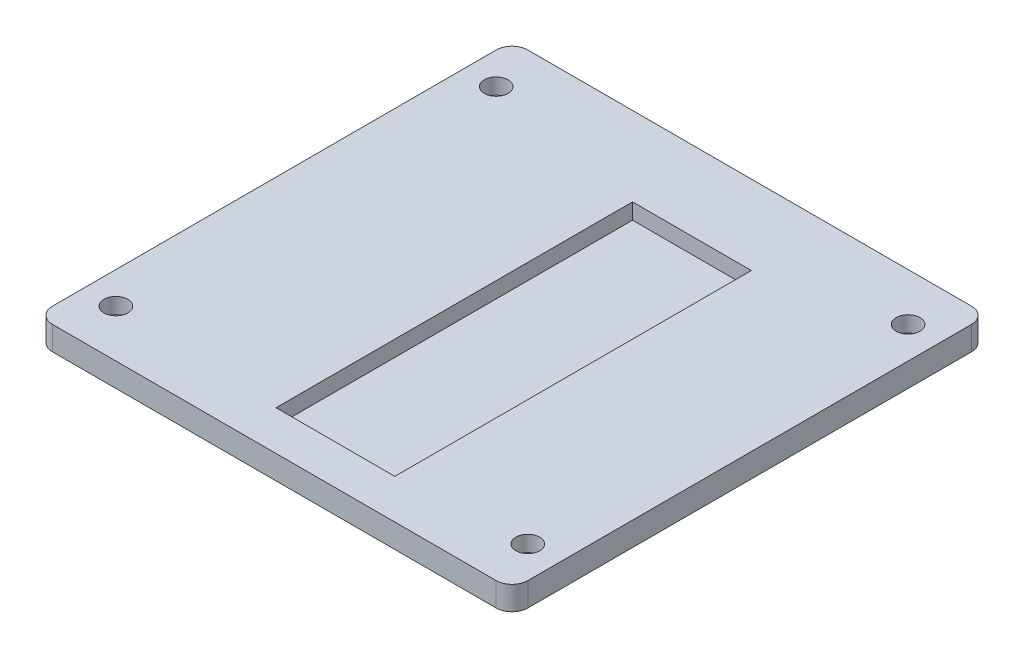
ISO-10303-21;
HEADER;
FILE_DESCRIPTION(('STEP AP214'),'2;1');
FILE_NAME('part.step','',(''),(''),'','','');
FILE_SCHEMA(('AUTOMOTIVE_DESIGN { 1 0 10303 214 1 1 1 1 }'));
ENDSEC;
DATA;
#1=APPLICATION_CONTEXT('core data for automotive mechanical design processes');
#2=APPLICATION_PROTOCOL_DEFINITION('international standard','automotive_design',2000,#1);
#3=PRODUCT_CONTEXT('',#1,'mechanical');
#4=PRODUCT('Part','Part','',(#3));
#5=PRODUCT_RELATED_PRODUCT_CATEGORY('part','',(#4));
#6=PRODUCT_DEFINITION_FORMATION('','',#4);
#7=PRODUCT_DEFINITION_CONTEXT('part definition',#1,'design');
#8=PRODUCT_DEFINITION('design','',#6,#7);
#9=PRODUCT_DEFINITION_SHAPE('','',#8);
#10=(LENGTH_UNIT() NAMED_UNIT(*) SI_UNIT(.MILLI.,.METRE.));
#11=(NAMED_UNIT(*) PLANE_ANGLE_UNIT() SI_UNIT($,.RADIAN.));
#12=(NAMED_UNIT(*) SI_UNIT($,.STERADIAN.) SOLID_ANGLE_UNIT());
#13=UNCERTAINTY_MEASURE_WITH_UNIT(LENGTH_MEASURE(1.E-05),#10,'distance_accuracy_value','');
#14=(GEOMETRIC_REPRESENTATION_CONTEXT(3) GLOBAL_UNCERTAINTY_ASSIGNED_CONTEXT((#13)) GLOBAL_UNIT_ASSIGNED_CONTEXT((#10,
#11,#12)) REPRESENTATION_CONTEXT('',''));
#15=CARTESIAN_POINT('',(0.,0.,0.));
#16=DIRECTION('',(0.,0.,1.));
#17=DIRECTION('',(1.,0.,0.));
#18=AXIS2_PLACEMENT_3D('',#15,#16,#17);
#19=CARTESIAN_POINT('',(0.,17.7123097466223,0.));
#20=DIRECTION('',(0.,1.,0.));
#21=DIRECTION('',(0.,0.,1.));
#22=AXIS2_PLACEMENT_3D('',#19,#20,#21);
#23=CYLINDRICAL_SURFACE('',#22,4.5);
#24=CARTESIAN_POINT('',(0.,6.70800725090938,0.));
#25=DIRECTION('',(0.,1.,0.));
#26=DIRECTION('',(0.,0.,1.));
#27=AXIS2_PLACEMENT_3D('',#24,#25,#26);
#28=CIRCLE('',#27,4.5);
#29=CARTESIAN_POINT('',(0.,6.70800725090938,4.5));
#30=VERTEX_POINT('',#29);
#31=EDGE_CURVE('E500',#30,#30,#28,.T.);
#32=ORIENTED_EDGE('',*,*,#31,.F.);
#33=EDGE_LOOP('',(#32));
#34=FACE_BOUND('',#33,.T.);
#35=CARTESIAN_POINT('',(0.,-1.29199274909062,0.));
#36=DIRECTION('',(0.,1.,0.));
#37=DIRECTION('',(0.,0.,1.));
#38=AXIS2_PLACEMENT_3D('',#35,#36,#37);
#39=CIRCLE('',#38,4.5);
#40=CARTESIAN_POINT('',(0.,-1.29199274909062,4.5));
#41=VERTEX_POINT('',#40);
#42=EDGE_CURVE('E292',#41,#41,#39,.T.);
#43=ORIENTED_EDGE('',*,*,#42,.T.);
#44=EDGE_LOOP('',(#43));
#45=FACE_BOUND('',#44,.T.);
#46=CARTESIAN_POINT('',(4.24264068711928,4.70800725090938,1.5));
#47=CARTESIAN_POINT('',(4.24264041795651,4.62630498865527,1.50000038692157));
#48=CARTESIAN_POINT('',(4.24502653936286,4.54460505117399,1.49330217552828));
#49=CARTESIAN_POINT('',(4.25426361121882,4.38362561941801,1.46677669753321));
#50=CARTESIAN_POINT('',(4.26111529713283,4.30434652610068,1.4469472682526));
#51=CARTESIAN_POINT('',(4.27842305533187,4.15056691141345,1.39493322852736));
#52=CARTESIAN_POINT('',(4.28887205956982,4.07605735674531,1.36277283210487));
#53=CARTESIAN_POINT('',(4.31218683015487,3.93346717808744,1.28709244266207));
#54=CARTESIAN_POINT('',(4.32505312955418,3.86538797707893,1.24356994329027));
#55=CARTESIAN_POINT('',(4.3523173411121,3.73492730740191,1.14457671966432));
#56=CARTESIAN_POINT('',(4.36675342266966,3.67283410790179,1.08873651206688));
#57=CARTESIAN_POINT('',(4.39520797201504,3.55869704907242,0.967481500821592));
#58=CARTESIAN_POINT('',(4.40922637243442,3.50665480353583,0.902065162578563));
#59=CARTESIAN_POINT('',(4.43570800382698,3.41278890491499,0.761406761947515));
#60=CARTESIAN_POINT('',(4.44812111552408,3.37126729498244,0.685952866836787));
#61=CARTESIAN_POINT('',(4.46954380156474,3.30161987321812,0.52864683448121));
#62=CARTESIAN_POINT('',(4.47855429304502,3.27349045114402,0.446796428530818));
#63=CARTESIAN_POINT('',(4.4918861314786,3.23240346896079,0.282043226150241));
#64=CARTESIAN_POINT('',(4.49635972166341,3.21895208152387,0.199276132279451));
#65=CARTESIAN_POINT('',(4.5006541232737,3.20603281086839,0.0325468122361351));
#66=CARTESIAN_POINT('',(4.50047613394335,3.20656132343075,-0.0514151003158404));
#67=CARTESIAN_POINT('',(4.49559059428104,3.22127363275843,-0.214655272790727));
#68=CARTESIAN_POINT('',(4.49106097132703,3.23492104362114,-0.293988072887502));
#69=CARTESIAN_POINT('',(4.4782045100957,3.27459672238006,-0.449165158233242));
#70=CARTESIAN_POINT('',(4.46987741446672,3.30062582937901,-0.525009206668764));
#71=CARTESIAN_POINT('',(4.45013505439938,3.36463922686858,-0.672228712263021));
#72=CARTESIAN_POINT('',(4.43868063786404,3.40277615872955,-0.743532331453497));
#73=CARTESIAN_POINT('',(4.41387589557997,3.48979680908197,-0.878886488290754));
#74=CARTESIAN_POINT('',(4.40052504300777,3.53868351589934,-0.942935001577154));
#75=CARTESIAN_POINT('',(4.37259287776335,3.64851884110049,-1.06515129982786));
#76=CARTESIAN_POINT('',(4.35798322759,3.70992698767754,-1.12290023560133));
#77=CARTESIAN_POINT('',(4.32971002867666,3.84168033949337,-1.22741588939383));
#78=CARTESIAN_POINT('',(4.31604662597174,3.91202691947924,-1.27418091490951));
#79=CARTESIAN_POINT('',(4.29105787703296,4.06098768933251,-1.3559811825641));
#80=CARTESIAN_POINT('',(4.27976864008232,4.1397054479611,-1.39083969547657));
#81=CARTESIAN_POINT('',(4.26122476317448,4.30236434230878,-1.44666478994926));
#82=CARTESIAN_POINT('',(4.25396843251834,4.38630327274212,-1.46763719363329));
#83=CARTESIAN_POINT('',(4.24469454453105,4.55296478401031,-1.49424192313571));
#84=CARTESIAN_POINT('',(4.24245540472708,4.63557138802797,-1.50052364325862));
#85=CARTESIAN_POINT('',(4.242850080942,4.80067147458494,-1.49940815836741));
#86=CARTESIAN_POINT('',(4.24548301189151,4.88316497494652,-1.49201343784089));
#87=CARTESIAN_POINT('',(4.25510427134068,5.04274269947613,-1.46433847732775));
#88=CARTESIAN_POINT('',(4.2619398816089,5.11991539613534,-1.44450959097083));
#89=CARTESIAN_POINT('',(4.27902830506905,5.26982266026846,-1.39307079384089));
#90=CARTESIAN_POINT('',(4.2892817240236,5.34255643829563,-1.36145879454519));
#91=CARTESIAN_POINT('',(4.31245316393576,5.4840778821798,-1.28621151110835));
#92=CARTESIAN_POINT('',(4.32544538498414,5.55266721487206,-1.24222667753773));
#93=CARTESIAN_POINT('',(4.35248653096475,5.68172632948498,-1.14387844583635));
#94=CARTESIAN_POINT('',(4.36653576665699,5.74219370890122,-1.08951198824818));
#95=CARTESIAN_POINT('',(4.39492557956765,5.85629922704533,-0.968837558850484));
#96=CARTESIAN_POINT('',(4.40924765366842,5.90946883593766,-0.902080905819977));
#97=CARTESIAN_POINT('',(4.43590277419665,6.00388146443145,-0.760240937100386));
#98=CARTESIAN_POINT('',(4.44823589126542,6.04512490765302,-0.685157917296829));
#99=CARTESIAN_POINT('',(4.46946608715904,6.11413740820195,-0.529169793648443));
#100=CARTESIAN_POINT('',(4.47838545006796,6.14199416663148,-0.448306684981795));
#101=CARTESIAN_POINT('',(4.49187916256662,6.18359886399954,-0.282687698769025));
#102=CARTESIAN_POINT('',(4.49645508051028,6.19735189573014,-0.197933237930834));
#103=CARTESIAN_POINT('',(4.50062794854384,6.20990036731785,-0.0312230037900617));
#104=CARTESIAN_POINT('',(4.50044880134158,6.20936843180795,0.0506770858800273));
#105=CARTESIAN_POINT('',(4.49568294779097,6.19502128868977,0.21316671750026));
#106=CARTESIAN_POINT('',(4.49109659900363,6.18120715868023,0.293756365228585));
#107=CARTESIAN_POINT('',(4.47811372431618,6.14113389904544,0.450063179148088));
#108=CARTESIAN_POINT('',(4.46977887541722,6.11507592787998,0.525837406369183));
#109=CARTESIAN_POINT('',(4.45015741056742,6.05144095426365,0.671967526409693));
#110=CARTESIAN_POINT('',(4.43887026072024,6.01386186811386,0.742322436213648));
#111=CARTESIAN_POINT('',(4.41398803241821,5.92665298275637,0.878451024463178));
#112=CARTESIAN_POINT('',(4.40032308737889,5.87662922283692,0.94395937733641));
#113=CARTESIAN_POINT('',(4.37239483187819,5.76662116417509,1.06587153940864));
#114=CARTESIAN_POINT('',(4.35813133159645,5.70663368751529,1.12227243243689));
#115=CARTESIAN_POINT('',(4.32994919738397,5.57559321752896,1.22661271324968));
#116=CARTESIAN_POINT('',(4.31606591982946,5.50419898444442,1.27413444899685));
#117=CARTESIAN_POINT('',(4.29090289984522,5.35400561055521,1.35647151495167));
#118=CARTESIAN_POINT('',(4.27962247741874,5.27520841136488,1.39129016522921));
#119=CARTESIAN_POINT('',(4.26152001309772,5.11606451488593,1.44576574230625));
#120=CARTESIAN_POINT('',(4.25451949285773,5.03594885562133,1.46603686372428));
#121=CARTESIAN_POINT('',(4.24508075309277,4.87322317520933,1.4931514802239));
#122=CARTESIAN_POINT('',(4.24264095926191,4.79061402479332,1.49999960879489));
#123=CARTESIAN_POINT('',(4.24264068711928,4.70800725090938,1.5));
#124=B_SPLINE_CURVE_WITH_KNOTS('',3,(#46,#47,#48,#49,#50,#51,#52,#53,#54,#55,#56,#57,#58,#59,
#60,#61,#62,#63,#64,#65,#66,#67,#68,#69,#70,#71,#72,#73,#74,#75,#76,#77,#78,#79,#80,#81,#82,#83,
#84,#85,#86,#87,#88,#89,#90,#91,#92,#93,#94,#95,#96,#97,#98,#99,#100,#101,#102,#103,#104,#105,
#106,#107,#108,#109,#110,#111,#112,#113,#114,#115,#116,#117,#118,#119,#120,#121,#122,#123),
.UNSPECIFIED.,.T.,.F.,(4,2,2,2,2,2,2,2,2,2,2,2,2,2,2,2,2,2,2,2,2,2,2,2,2,2,2,2,2,2,2,2,2,2,2,2,
2,2,4),(0.,0.244800877199033,0.489642082522746,0.734004941251242,0.978421749278163,
1.23152006141352,1.48465897757982,1.74440259215486,2.00407614580184,2.25471478147401,
2.50528879953491,2.74603507238354,2.98679766283855,3.23072482290503,3.47471987811033,
3.73020261545876,3.98572469418159,4.24488959763007,4.50394577031475,4.75131437043211,
4.99863803752403,5.23746593649716,5.47633618716971,5.72278286600124,5.96930228489743,
6.22768212253191,6.4860527813285,6.74270686782829,6.99926824502787,7.24377127013005,
7.48825446011223,7.72885434057197,7.96949776141416,8.21903279277502,8.46864756645499,
8.72803354100769,8.98735167396852,9.23494818240588,9.48245920782247),.UNSPECIFIED.);
#125=CARTESIAN_POINT('',(4.24264068711928,4.70800725090938,1.5));
#126=VERTEX_POINT('',#125);
#127=EDGE_CURVE('E282',#126,#126,#124,.T.);
#128=ORIENTED_EDGE('',*,*,#127,.F.);
#129=EDGE_LOOP('',(#128));
#130=FACE_BOUND('',#129,.T.);
#131=ADVANCED_FACE('F50',(#34,#45,#130),#23,.T.);
#132=CARTESIAN_POINT('',(-22.,7.70800725090938,0.));
#133=DIRECTION('',(0.,-1.,0.));
#134=DIRECTION('',(0.,0.,-1.));
#135=AXIS2_PLACEMENT_3D('',#132,#133,#134);
#136=PLANE('',#135);
#137=CARTESIAN_POINT('',(0.,7.70800725090938,0.));
#138=DIRECTION('',(0.,1.,0.));
#139=DIRECTION('',(0.,0.,1.));
#140=AXIS2_PLACEMENT_3D('',#137,#138,#139);
#141=CIRCLE('',#140,13.4884037015069);
#142=CARTESIAN_POINT('',(0.,7.70800725090938,13.4884037015069));
#143=VERTEX_POINT('',#142);
#144=EDGE_CURVE('E493',#143,#143,#141,.T.);
#145=ORIENTED_EDGE('',*,*,#144,.T.);
#146=EDGE_LOOP('',(#145));
#147=FACE_BOUND('',#146,.T.);
#148=DIRECTION('',(0.,0.,1.));
#149=VECTOR('',#148,1.);
#150=CARTESIAN_POINT('',(-30.,7.70800725090938,30.));
#151=LINE('',#150,#149);
#152=CARTESIAN_POINT('',(-30.,7.70800725090938,-28.));
#153=VERTEX_POINT('',#152);
#154=CARTESIAN_POINT('',(-30.,7.70800725090938,28.));
#155=VERTEX_POINT('',#154);
#156=EDGE_CURVE('E248',#153,#155,#151,.T.);
#157=ORIENTED_EDGE('',*,*,#156,.F.);
#158=CARTESIAN_POINT('',(-28.,7.70800725090938,-28.));
#159=DIRECTION('',(0.,-1.,0.));
#160=DIRECTION('',(0.,0.,-1.));
#161=AXIS2_PLACEMENT_3D('',#158,#159,#160);
#162=CIRCLE('',#161,2.);
#163=CARTESIAN_POINT('',(-28.,7.70800725090938,-30.));
#164=VERTEX_POINT('',#163);
#165=EDGE_CURVE('E433',#153,#164,#162,.T.);
#166=ORIENTED_EDGE('',*,*,#165,.T.);
#167=DIRECTION('',(-1.,0.,0.));
#168=VECTOR('',#167,1.);
#169=CARTESIAN_POINT('',(-30.,7.70800725090938,-30.));
#170=LINE('',#169,#168);
#171=CARTESIAN_POINT('',(28.,7.70800725090938,-30.));
#172=VERTEX_POINT('',#171);
#173=EDGE_CURVE('E234',#172,#164,#170,.T.);
#174=ORIENTED_EDGE('',*,*,#173,.F.);
#175=CARTESIAN_POINT('',(28.,7.70800725090938,-28.));
#176=DIRECTION('',(0.,-1.,0.));
#177=DIRECTION('',(0.,0.,-1.));
#178=AXIS2_PLACEMENT_3D('',#175,#176,#177);
#179=CIRCLE('',#178,2.);
#180=CARTESIAN_POINT('',(30.,7.70800725090938,-28.));
#181=VERTEX_POINT('',#180);
#182=EDGE_CURVE('E426',#172,#181,#179,.T.);
#183=ORIENTED_EDGE('',*,*,#182,.T.);
#184=DIRECTION('',(0.,0.,-1.));
#185=VECTOR('',#184,1.);
#186=CARTESIAN_POINT('',(30.,7.70800725090938,30.));
#187=LINE('',#186,#185);
#188=CARTESIAN_POINT('',(30.,7.70800725090938,28.));
#189=VERTEX_POINT('',#188);
#190=EDGE_CURVE('E249',#189,#181,#187,.T.);
#191=ORIENTED_EDGE('',*,*,#190,.F.);
#192=CARTESIAN_POINT('',(28.,7.70800725090938,28.));
#193=DIRECTION('',(0.,-1.,0.));
#194=DIRECTION('',(0.,0.,-1.));
#195=AXIS2_PLACEMENT_3D('',#192,#193,#194);
#196=CIRCLE('',#195,2.);
#197=CARTESIAN_POINT('',(28.,7.70800725090938,30.));
#198=VERTEX_POINT('',#197);
#199=EDGE_CURVE('E72',#189,#198,#196,.T.);
#200=ORIENTED_EDGE('',*,*,#199,.T.);
#201=DIRECTION('',(1.,0.,0.));
#202=VECTOR('',#201,1.);
#203=CARTESIAN_POINT('',(-30.,7.70800725090938,30.));
#204=LINE('',#203,#202);
#205=CARTESIAN_POINT('',(-28.,7.70800725090938,30.));
#206=VERTEX_POINT('',#205);
#207=EDGE_CURVE('E253',#206,#198,#204,.T.);
#208=ORIENTED_EDGE('',*,*,#207,.F.);
#209=CARTESIAN_POINT('',(-28.,7.70800725090938,28.));
#210=DIRECTION('',(0.,-1.,0.));
#211=DIRECTION('',(0.,0.,-1.));
#212=AXIS2_PLACEMENT_3D('',#209,#210,#211);
#213=CIRCLE('',#212,2.);
#214=EDGE_CURVE('E429',#206,#155,#213,.T.);
#215=ORIENTED_EDGE('',*,*,#214,.T.);
#216=EDGE_LOOP('',(#157,#166,#174,#183,#191,#200,#208,#215));
#217=FACE_BOUND('',#216,.T.);
#218=ADVANCED_FACE('F381',(#147,#217),#136,.T.);
#219=CARTESIAN_POINT('',(0.,7.70800725090938,0.));
#220=DIRECTION('',(0.,1.,0.));
#221=DIRECTION('',(0.,0.,1.));
#222=AXIS2_PLACEMENT_3D('',#219,#220,#221);
#223=CONICAL_SURFACE('',#222,13.4884037015069,1.45999750712611);
#224=ORIENTED_EDGE('',*,*,#31,.T.);
#225=EDGE_LOOP('',(#224));
#226=FACE_BOUND('',#225,.T.);
#227=ORIENTED_EDGE('',*,*,#144,.F.);
#228=EDGE_LOOP('',(#227));
#229=FACE_BOUND('',#228,.T.);
#230=ADVANCED_FACE('F395',(#226,#229),#223,.T.);
#231=CARTESIAN_POINT('',(-4.5,-1.29199274909062,0.));
#232=DIRECTION('',(0.,-1.,0.));
#233=DIRECTION('',(0.,0.,-1.));
#234=AXIS2_PLACEMENT_3D('',#231,#232,#233);
#235=PLANE('',#234);
#236=CARTESIAN_POINT('',(0.,-1.29199274909062,0.));
#237=DIRECTION('',(0.,-1.,0.));
#238=DIRECTION('',(0.,0.,-1.));
#239=AXIS2_PLACEMENT_3D('',#236,#237,#238);
#240=CIRCLE('',#239,3.1);
#241=CARTESIAN_POINT('',(0.,-1.29199274909062,-3.1));
#242=VERTEX_POINT('',#241);
#243=EDGE_CURVE('E263',#242,#242,#240,.T.);
#244=ORIENTED_EDGE('',*,*,#243,.F.);
#245=EDGE_LOOP('',(#244));
#246=FACE_BOUND('',#245,.T.);
#247=ORIENTED_EDGE('',*,*,#42,.F.);
#248=EDGE_LOOP('',(#247));
#249=FACE_BOUND('',#248,.T.);
#250=ADVANCED_FACE('F400',(#246,#249),#235,.T.);
#251=CARTESIAN_POINT('',(22.001,4.70800725090938,0.));
#252=DIRECTION('',(-1.,0.,0.));
#253=DIRECTION('',(0.,0.,1.));
#254=AXIS2_PLACEMENT_3D('',#251,#252,#253);
#255=CYLINDRICAL_SURFACE('',#254,1.5);
#256=CARTESIAN_POINT('',(1.,4.70800725090938,0.));
#257=DIRECTION('',(1.,0.,0.));
#258=DIRECTION('',(0.,0.,-1.));
#259=AXIS2_PLACEMENT_3D('',#256,#257,#258);
#260=CIRCLE('',#259,1.5);
#261=CARTESIAN_POINT('',(1.,4.70800725090938,-1.5));
#262=VERTEX_POINT('',#261);
#263=EDGE_CURVE('E276',#262,#262,#260,.T.);
#264=ORIENTED_EDGE('',*,*,#263,.F.);
#265=EDGE_LOOP('',(#264));
#266=FACE_BOUND('',#265,.T.);
#267=ORIENTED_EDGE('',*,*,#127,.T.);
#268=EDGE_LOOP('',(#267));
#269=FACE_BOUND('',#268,.T.);
#270=ADVANCED_FACE('F295',(#266,#269),#255,.F.);
#271=CARTESIAN_POINT('',(0.,1.70800725090938,0.));
#272=DIRECTION('',(0.,1.,0.));
#273=DIRECTION('',(0.,0.,1.));
#274=AXIS2_PLACEMENT_3D('',#271,#272,#273);
#275=CYLINDRICAL_SURFACE('',#274,3.1);
#276=DIRECTION('',(0.,1.,0.));
#277=VECTOR('',#276,1.);
#278=CARTESIAN_POINT('',(1.,1.70800725090938,2.93428015022424));
#279=LINE('',#278,#277);
#280=CARTESIAN_POINT('',(1.,2.30847630481279,2.93428015022424));
#281=VERTEX_POINT('',#280);
#282=CARTESIAN_POINT('',(1.,7.70800725090938,2.93428015022424));
#283=VERTEX_POINT('',#282);
#284=EDGE_CURVE('E278',#281,#283,#279,.T.);
#285=ORIENTED_EDGE('',*,*,#284,.F.);
#286=CARTESIAN_POINT('',(0.,3.30847630481277,0.));
#287=DIRECTION('',(0.707106781186542,0.707106781186553,0.));
#288=DIRECTION('',(-0.707106781186553,0.707106781186542,0.));
#289=AXIS2_PLACEMENT_3D('',#286,#287,#288);
#290=ELLIPSE('',#289,4.38406204335656,3.1);
#291=CARTESIAN_POINT('',(1.5,1.80847630481279,2.71293199325011));
#292=VERTEX_POINT('',#291);
#293=EDGE_CURVE('E482',#281,#292,#290,.T.);
#294=ORIENTED_EDGE('',*,*,#293,.T.);
#295=CARTESIAN_POINT('',(0.,1.80847630481279,0.));
#296=DIRECTION('',(0.,1.,0.));
#297=DIRECTION('',(0.,0.,1.));
#298=AXIS2_PLACEMENT_3D('',#295,#296,#297);
#299=CIRCLE('',#298,3.1);
#300=CARTESIAN_POINT('',(1.5,1.80847630481279,-2.71293199325011));
#301=VERTEX_POINT('',#300);
#302=EDGE_CURVE('E251',#292,#301,#299,.T.);
#303=ORIENTED_EDGE('',*,*,#302,.T.);
#304=CARTESIAN_POINT('',(0.,3.30847630481277,0.));
#305=DIRECTION('',(0.707106781186542,0.707106781186553,0.));
#306=DIRECTION('',(-0.707106781186553,0.707106781186542,0.));
#307=AXIS2_PLACEMENT_3D('',#304,#305,#306);
#308=ELLIPSE('',#307,4.38406204335656,3.1);
#309=CARTESIAN_POINT('',(1.,2.30847630481279,-2.93428015022424));
#310=VERTEX_POINT('',#309);
#311=EDGE_CURVE('E477',#301,#310,#308,.T.);
#312=ORIENTED_EDGE('',*,*,#311,.T.);
#313=DIRECTION('',(0.,1.,0.));
#314=VECTOR('',#313,1.);
#315=CARTESIAN_POINT('',(1.,1.70800725090938,-2.93428015022424));
#316=LINE('',#315,#314);
#317=CARTESIAN_POINT('',(1.,7.70800725090938,-2.93428015022424));
#318=VERTEX_POINT('',#317);
#319=EDGE_CURVE('E279',#310,#318,#316,.T.);
#320=ORIENTED_EDGE('',*,*,#319,.T.);
#321=CARTESIAN_POINT('',(0.,7.70800725090938,0.));
#322=DIRECTION('',(0.,1.,0.));
#323=DIRECTION('',(0.,0.,1.));
#324=AXIS2_PLACEMENT_3D('',#321,#322,#323);
#325=CIRCLE('',#324,3.1);
#326=EDGE_CURVE('E270',#318,#283,#325,.T.);
#327=ORIENTED_EDGE('',*,*,#326,.T.);
#328=EDGE_LOOP('',(#285,#294,#303,#312,#320,#327));
#329=FACE_BOUND('',#328,.T.);
#330=ORIENTED_EDGE('',*,*,#243,.T.);
#331=EDGE_LOOP('',(#330));
#332=FACE_BOUND('',#331,.T.);
#333=ADVANCED_FACE('F299',(#329,#332),#275,.F.);
#334=CARTESIAN_POINT('',(1.,1.70800725090938,-2.93428015022424));
#335=DIRECTION('',(1.,0.,0.));
#336=DIRECTION('',(0.,0.,-1.));
#337=AXIS2_PLACEMENT_3D('',#334,#335,#336);
#338=PLANE('',#337);
#339=ORIENTED_EDGE('',*,*,#263,.T.);
#340=EDGE_LOOP('',(#339));
#341=FACE_BOUND('',#340,.T.);
#342=ORIENTED_EDGE('',*,*,#319,.F.);
#343=DIRECTION('',(0.,0.,1.));
#344=VECTOR('',#343,1.);
#345=CARTESIAN_POINT('',(1.,2.30847630481279,-2.93428015022424));
#346=LINE('',#345,#344);
#347=EDGE_CURVE('E487',#310,#281,#346,.T.);
#348=ORIENTED_EDGE('',*,*,#347,.T.);
#349=ORIENTED_EDGE('',*,*,#284,.T.);
#350=DIRECTION('',(0.,0.,-1.));
#351=VECTOR('',#350,1.);
#352=CARTESIAN_POINT('',(1.,7.70800725090938,-2.93428015022424));
#353=LINE('',#352,#351);
#354=EDGE_CURVE('E275',#283,#318,#353,.T.);
#355=ORIENTED_EDGE('',*,*,#354,.T.);
#356=EDGE_LOOP('',(#342,#348,#349,#355));
#357=FACE_BOUND('',#356,.T.);
#358=ADVANCED_FACE('F305',(#341,#357),#338,.F.);
#359=CARTESIAN_POINT('',(0.,7.70800725090938,0.));
#360=DIRECTION('',(0.,1.,0.));
#361=DIRECTION('',(0.,0.,1.));
#362=AXIS2_PLACEMENT_3D('',#359,#360,#361);
#363=PLANE('',#362);
#364=ORIENTED_EDGE('',*,*,#326,.F.);
#365=ORIENTED_EDGE('',*,*,#354,.F.);
#366=EDGE_LOOP('',(#364,#365));
#367=FACE_BOUND('',#366,.T.);
#368=ADVANCED_FACE('F306',(#367),#363,.F.);
#369=CARTESIAN_POINT('',(0.,1.80847630481279,0.));
#370=DIRECTION('',(0.,1.,0.));
#371=DIRECTION('',(0.,0.,1.));
#372=AXIS2_PLACEMENT_3D('',#369,#370,#371);
#373=PLANE('',#372);
#374=ORIENTED_EDGE('',*,*,#302,.F.);
#375=DIRECTION('',(0.,0.,-1.));
#376=VECTOR('',#375,1.);
#377=CARTESIAN_POINT('',(1.5,1.80847630481279,0.));
#378=LINE('',#377,#376);
#379=EDGE_CURVE('E481',#292,#301,#378,.T.);
#380=ORIENTED_EDGE('',*,*,#379,.T.);
#381=EDGE_LOOP('',(#374,#380));
#382=FACE_BOUND('',#381,.T.);
#383=ADVANCED_FACE('F309',(#382),#373,.F.);
#384=CARTESIAN_POINT('',(1.,2.30847630481279,-2.93428015022424));
#385=DIRECTION('',(0.707106781186542,0.707106781186553,0.));
#386=DIRECTION('',(0.,0.,1.));
#387=AXIS2_PLACEMENT_3D('',#384,#385,#386);
#388=PLANE('',#387);
#389=ORIENTED_EDGE('',*,*,#311,.F.);
#390=ORIENTED_EDGE('',*,*,#379,.F.);
#391=ORIENTED_EDGE('',*,*,#293,.F.);
#392=ORIENTED_EDGE('',*,*,#347,.F.);
#393=EDGE_LOOP('',(#389,#390,#391,#392));
#394=FACE_BOUND('',#393,.T.);
#395=ADVANCED_FACE('F313',(#394),#388,.F.);
#396=CARTESIAN_POINT('',(-30.,-77.1448064914763,-30.));
#397=DIRECTION('',(0.,0.,-1.));
#398=DIRECTION('',(-1.,0.,0.));
#399=AXIS2_PLACEMENT_3D('',#396,#397,#398);
#400=PLANE('',#399);
#401=ORIENTED_EDGE('',*,*,#173,.T.);
#402=DIRECTION('',(0.,1.,0.));
#403=VECTOR('',#402,1.);
#404=CARTESIAN_POINT('',(-28.,-77.1448064914763,-30.));
#405=LINE('',#404,#403);
#406=CARTESIAN_POINT('',(-28.,10.7080072509094,-30.));
#407=VERTEX_POINT('',#406);
#408=EDGE_CURVE('E473',#164,#407,#405,.T.);
#409=ORIENTED_EDGE('',*,*,#408,.T.);
#410=DIRECTION('',(-1.,0.,0.));
#411=VECTOR('',#410,1.);
#412=CARTESIAN_POINT('',(-30.,10.7080072509094,-30.));
#413=LINE('',#412,#411);
#414=CARTESIAN_POINT('',(28.,10.7080072509094,-30.));
#415=VERTEX_POINT('',#414);
#416=EDGE_CURVE('E237',#415,#407,#413,.T.);
#417=ORIENTED_EDGE('',*,*,#416,.F.);
#418=DIRECTION('',(0.,1.,0.));
#419=VECTOR('',#418,1.);
#420=CARTESIAN_POINT('',(28.,-77.1448064914763,-30.));
#421=LINE('',#420,#419);
#422=EDGE_CURVE('E471',#415,#172,#421,.F.);
#423=ORIENTED_EDGE('',*,*,#422,.T.);
#424=EDGE_LOOP('',(#401,#409,#417,#423));
#425=FACE_BOUND('',#424,.T.);
#426=ADVANCED_FACE('F317',(#425),#400,.T.);
#427=CARTESIAN_POINT('',(-30.,-77.1448064914763,30.));
#428=DIRECTION('',(-1.,0.,0.));
#429=DIRECTION('',(0.,0.,1.));
#430=AXIS2_PLACEMENT_3D('',#427,#428,#429);
#431=PLANE('',#430);
#432=DIRECTION('',(0.,0.,1.));
#433=VECTOR('',#432,1.);
#434=CARTESIAN_POINT('',(-30.,10.7080072509094,30.));
#435=LINE('',#434,#433);
#436=CARTESIAN_POINT('',(-30.,10.7080072509094,-28.));
#437=VERTEX_POINT('',#436);
#438=CARTESIAN_POINT('',(-30.,10.7080072509094,28.));
#439=VERTEX_POINT('',#438);
#440=EDGE_CURVE('E232',#437,#439,#435,.T.);
#441=ORIENTED_EDGE('',*,*,#440,.F.);
#442=DIRECTION('',(0.,1.,0.));
#443=VECTOR('',#442,1.);
#444=CARTESIAN_POINT('',(-30.,-77.1448064914763,-28.));
#445=LINE('',#444,#443);
#446=EDGE_CURVE('E434',#437,#153,#445,.F.);
#447=ORIENTED_EDGE('',*,*,#446,.T.);
#448=ORIENTED_EDGE('',*,*,#156,.T.);
#449=DIRECTION('',(0.,1.,0.));
#450=VECTOR('',#449,1.);
#451=CARTESIAN_POINT('',(-30.,-77.1448064914763,28.));
#452=LINE('',#451,#450);
#453=EDGE_CURVE('E452',#155,#439,#452,.T.);
#454=ORIENTED_EDGE('',*,*,#453,.T.);
#455=EDGE_LOOP('',(#441,#447,#448,#454));
#456=FACE_BOUND('',#455,.T.);
#457=ADVANCED_FACE('F316',(#456),#431,.T.);
#458=CARTESIAN_POINT('',(-30.,-77.1448064914763,30.));
#459=DIRECTION('',(0.,0.,1.));
#460=DIRECTION('',(1.,0.,0.));
#461=AXIS2_PLACEMENT_3D('',#458,#459,#460);
#462=PLANE('',#461);
#463=ORIENTED_EDGE('',*,*,#207,.T.);
#464=DIRECTION('',(0.,1.,0.));
#465=VECTOR('',#464,1.);
#466=CARTESIAN_POINT('',(28.,-77.1448064914763,30.));
#467=LINE('',#466,#465);
#468=CARTESIAN_POINT('',(28.,10.7080072509094,30.));
#469=VERTEX_POINT('',#468);
#470=EDGE_CURVE('E11',#198,#469,#467,.T.);
#471=ORIENTED_EDGE('',*,*,#470,.T.);
#472=DIRECTION('',(1.,0.,0.));
#473=VECTOR('',#472,1.);
#474=CARTESIAN_POINT('',(-30.,10.7080072509094,30.));
#475=LINE('',#474,#473);
#476=CARTESIAN_POINT('',(-28.,10.7080072509094,30.));
#477=VERTEX_POINT('',#476);
#478=EDGE_CURVE('E229',#477,#469,#475,.T.);
#479=ORIENTED_EDGE('',*,*,#478,.F.);
#480=DIRECTION('',(0.,1.,0.));
#481=VECTOR('',#480,1.);
#482=CARTESIAN_POINT('',(-28.,-77.1448064914763,30.));
#483=LINE('',#482,#481);
#484=EDGE_CURVE('E57',#477,#206,#483,.F.);
#485=ORIENTED_EDGE('',*,*,#484,.T.);
#486=EDGE_LOOP('',(#463,#471,#479,#485));
#487=FACE_BOUND('',#486,.T.);
#488=ADVANCED_FACE('F322',(#487),#462,.T.);
#489=CARTESIAN_POINT('',(30.,-77.1448064914763,30.));
#490=DIRECTION('',(1.,0.,0.));
#491=DIRECTION('',(0.,0.,-1.));
#492=AXIS2_PLACEMENT_3D('',#489,#490,#491);
#493=PLANE('',#492);
#494=ORIENTED_EDGE('',*,*,#190,.T.);
#495=DIRECTION('',(0.,1.,0.));
#496=VECTOR('',#495,1.);
#497=CARTESIAN_POINT('',(30.,-77.1448064914763,-28.));
#498=LINE('',#497,#496);
#499=CARTESIAN_POINT('',(30.,10.7080072509094,-28.));
#500=VERTEX_POINT('',#499);
#501=EDGE_CURVE('E442',#181,#500,#498,.T.);
#502=ORIENTED_EDGE('',*,*,#501,.T.);
#503=DIRECTION('',(0.,0.,-1.));
#504=VECTOR('',#503,1.);
#505=CARTESIAN_POINT('',(30.,10.7080072509094,30.));
#506=LINE('',#505,#504);
#507=CARTESIAN_POINT('',(30.,10.7080072509094,28.));
#508=VERTEX_POINT('',#507);
#509=EDGE_CURVE('E228',#508,#500,#506,.T.);
#510=ORIENTED_EDGE('',*,*,#509,.F.);
#511=DIRECTION('',(0.,1.,0.));
#512=VECTOR('',#511,1.);
#513=CARTESIAN_POINT('',(30.,-77.1448064914763,28.));
#514=LINE('',#513,#512);
#515=EDGE_CURVE('E428',#508,#189,#514,.F.);
#516=ORIENTED_EDGE('',*,*,#515,.T.);
#517=EDGE_LOOP('',(#494,#502,#510,#516));
#518=FACE_BOUND('',#517,.T.);
#519=ADVANCED_FACE('F330',(#518),#493,.T.);
#520=CARTESIAN_POINT('',(0.,10.7080072509094,0.));
#521=DIRECTION('',(0.,1.,0.));
#522=DIRECTION('',(0.,0.,1.));
#523=AXIS2_PLACEMENT_3D('',#520,#521,#522);
#524=PLANE('',#523);
#525=CARTESIAN_POINT('',(-26.,10.7080072509094,24.));
#526=DIRECTION('',(0.,1.,0.));
#527=DIRECTION('',(0.,0.,1.));
#528=AXIS2_PLACEMENT_3D('',#525,#526,#527);
#529=CIRCLE('',#528,1.5);
#530=CARTESIAN_POINT('',(-26.,10.7080072509094,25.5));
#531=VERTEX_POINT('',#530);
#532=EDGE_CURVE('E203',#531,#531,#529,.T.);
#533=ORIENTED_EDGE('',*,*,#532,.F.);
#534=EDGE_LOOP('',(#533));
#535=FACE_BOUND('',#534,.T.);
#536=CARTESIAN_POINT('',(26.,10.7080072509094,24.));
#537=DIRECTION('',(0.,1.,0.));
#538=DIRECTION('',(0.,0.,1.));
#539=AXIS2_PLACEMENT_3D('',#536,#537,#538);
#540=CIRCLE('',#539,1.5);
#541=CARTESIAN_POINT('',(26.,10.7080072509094,25.5));
#542=VERTEX_POINT('',#541);
#543=EDGE_CURVE('E215',#542,#542,#540,.T.);
#544=ORIENTED_EDGE('',*,*,#543,.F.);
#545=EDGE_LOOP('',(#544));
#546=FACE_BOUND('',#545,.T.);
#547=CARTESIAN_POINT('',(26.,10.7080072509094,-24.));
#548=DIRECTION('',(0.,1.,0.));
#549=DIRECTION('',(0.,0.,1.));
#550=AXIS2_PLACEMENT_3D('',#547,#548,#549);
#551=CIRCLE('',#550,1.5);
#552=CARTESIAN_POINT('',(26.,10.7080072509094,-22.5));
#553=VERTEX_POINT('',#552);
#554=EDGE_CURVE('E187',#553,#553,#551,.T.);
#555=ORIENTED_EDGE('',*,*,#554,.F.);
#556=EDGE_LOOP('',(#555));
#557=FACE_BOUND('',#556,.T.);
#558=DIRECTION('',(0.,0.,1.));
#559=VECTOR('',#558,1.);
#560=CARTESIAN_POINT('',(-4.78635435480523,10.7080072509094,-20.));
#561=LINE('',#560,#559);
#562=CARTESIAN_POINT('',(-4.78635435480523,10.7080072509094,-20.));
#563=VERTEX_POINT('',#562);
#564=CARTESIAN_POINT('',(-4.78635435480523,10.7080072509094,25.));
#565=VERTEX_POINT('',#564);
#566=EDGE_CURVE('E62',#563,#565,#561,.T.);
#567=ORIENTED_EDGE('',*,*,#566,.F.);
#568=DIRECTION('',(-1.,0.,0.));
#569=VECTOR('',#568,1.);
#570=CARTESIAN_POINT('',(-4.78635435480523,10.7080072509094,-20.));
#571=LINE('',#570,#569);
#572=CARTESIAN_POINT('',(10.2136456451948,10.7080072509094,-20.));
#573=VERTEX_POINT('',#572);
#574=EDGE_CURVE('E170',#573,#563,#571,.T.);
#575=ORIENTED_EDGE('',*,*,#574,.F.);
#576=DIRECTION('',(0.,0.,-1.));
#577=VECTOR('',#576,1.);
#578=CARTESIAN_POINT('',(10.2136456451948,10.7080072509094,-20.));
#579=LINE('',#578,#577);
#580=CARTESIAN_POINT('',(10.2136456451948,10.7080072509094,25.));
#581=VERTEX_POINT('',#580);
#582=EDGE_CURVE('E173',#581,#573,#579,.T.);
#583=ORIENTED_EDGE('',*,*,#582,.F.);
#584=DIRECTION('',(1.,0.,0.));
#585=VECTOR('',#584,1.);
#586=CARTESIAN_POINT('',(-4.78635435480523,10.7080072509094,25.));
#587=LINE('',#586,#585);
#588=EDGE_CURVE('E177',#565,#581,#587,.T.);
#589=ORIENTED_EDGE('',*,*,#588,.F.);
#590=EDGE_LOOP('',(#567,#575,#583,#589));
#591=FACE_BOUND('',#590,.T.);
#592=CARTESIAN_POINT('',(-26.,10.7080072509094,-24.));
#593=DIRECTION('',(0.,1.,0.));
#594=DIRECTION('',(0.,0.,1.));
#595=AXIS2_PLACEMENT_3D('',#592,#593,#594);
#596=CIRCLE('',#595,1.5);
#597=CARTESIAN_POINT('',(-26.,10.7080072509094,-22.5));
#598=VERTEX_POINT('',#597);
#599=EDGE_CURVE('E209',#598,#598,#596,.T.);
#600=ORIENTED_EDGE('',*,*,#599,.F.);
#601=EDGE_LOOP('',(#600));
#602=FACE_BOUND('',#601,.T.);
#603=ORIENTED_EDGE('',*,*,#416,.T.);
#604=CARTESIAN_POINT('',(-28.,10.7080072509094,-28.));
#605=DIRECTION('',(0.,1.,0.));
#606=DIRECTION('',(0.,0.,1.));
#607=AXIS2_PLACEMENT_3D('',#604,#605,#606);
#608=CIRCLE('',#607,2.);
#609=EDGE_CURVE('E460',#407,#437,#608,.T.);
#610=ORIENTED_EDGE('',*,*,#609,.T.);
#611=ORIENTED_EDGE('',*,*,#440,.T.);
#612=CARTESIAN_POINT('',(-28.,10.7080072509094,28.));
#613=DIRECTION('',(0.,1.,0.));
#614=DIRECTION('',(0.,0.,1.));
#615=AXIS2_PLACEMENT_3D('',#612,#613,#614);
#616=CIRCLE('',#615,2.);
#617=EDGE_CURVE('E455',#439,#477,#616,.T.);
#618=ORIENTED_EDGE('',*,*,#617,.T.);
#619=ORIENTED_EDGE('',*,*,#478,.T.);
#620=CARTESIAN_POINT('',(28.,10.7080072509094,28.));
#621=DIRECTION('',(0.,1.,0.));
#622=DIRECTION('',(0.,0.,1.));
#623=AXIS2_PLACEMENT_3D('',#620,#621,#622);
#624=CIRCLE('',#623,2.);
#625=EDGE_CURVE('E467',#469,#508,#624,.T.);
#626=ORIENTED_EDGE('',*,*,#625,.T.);
#627=ORIENTED_EDGE('',*,*,#509,.T.);
#628=CARTESIAN_POINT('',(28.,10.7080072509094,-28.));
#629=DIRECTION('',(0.,1.,0.));
#630=DIRECTION('',(0.,0.,1.));
#631=AXIS2_PLACEMENT_3D('',#628,#629,#630);
#632=CIRCLE('',#631,2.);
#633=EDGE_CURVE('E462',#500,#415,#632,.T.);
#634=ORIENTED_EDGE('',*,*,#633,.T.);
#635=EDGE_LOOP('',(#603,#610,#611,#618,#619,#626,#627,#634));
#636=FACE_BOUND('',#635,.T.);
#637=ADVANCED_FACE('F176',(#535,#546,#557,#591,#602,#636),#524,.T.);
#638=CARTESIAN_POINT('',(-28.,-77.1448064914763,-28.));
#639=DIRECTION('',(0.,1.,0.));
#640=DIRECTION('',(0.,0.,1.));
#641=AXIS2_PLACEMENT_3D('',#638,#639,#640);
#642=CYLINDRICAL_SURFACE('',#641,2.);
#643=ORIENTED_EDGE('',*,*,#165,.F.);
#644=ORIENTED_EDGE('',*,*,#446,.F.);
#645=ORIENTED_EDGE('',*,*,#609,.F.);
#646=ORIENTED_EDGE('',*,*,#408,.F.);
#647=EDGE_LOOP('',(#643,#644,#645,#646));
#648=FACE_BOUND('',#647,.T.);
#649=ADVANCED_FACE('F401',(#648),#642,.T.);
#650=CARTESIAN_POINT('',(28.,-77.1448064914763,-28.));
#651=DIRECTION('',(0.,1.,0.));
#652=DIRECTION('',(0.,0.,1.));
#653=AXIS2_PLACEMENT_3D('',#650,#651,#652);
#654=CYLINDRICAL_SURFACE('',#653,2.);
#655=ORIENTED_EDGE('',*,*,#182,.F.);
#656=ORIENTED_EDGE('',*,*,#422,.F.);
#657=ORIENTED_EDGE('',*,*,#633,.F.);
#658=ORIENTED_EDGE('',*,*,#501,.F.);
#659=EDGE_LOOP('',(#655,#656,#657,#658));
#660=FACE_BOUND('',#659,.T.);
#661=ADVANCED_FACE('F412',(#660),#654,.T.);
#662=CARTESIAN_POINT('',(28.,-77.1448064914763,28.));
#663=DIRECTION('',(0.,1.,0.));
#664=DIRECTION('',(0.,0.,1.));
#665=AXIS2_PLACEMENT_3D('',#662,#663,#664);
#666=CYLINDRICAL_SURFACE('',#665,2.);
#667=ORIENTED_EDGE('',*,*,#199,.F.);
#668=ORIENTED_EDGE('',*,*,#515,.F.);
#669=ORIENTED_EDGE('',*,*,#625,.F.);
#670=ORIENTED_EDGE('',*,*,#470,.F.);
#671=EDGE_LOOP('',(#667,#668,#669,#670));
#672=FACE_BOUND('',#671,.T.);
#673=ADVANCED_FACE('F417',(#672),#666,.T.);
#674=CARTESIAN_POINT('',(-28.,-77.1448064914763,28.));
#675=DIRECTION('',(0.,1.,0.));
#676=DIRECTION('',(0.,0.,1.));
#677=AXIS2_PLACEMENT_3D('',#674,#675,#676);
#678=CYLINDRICAL_SURFACE('',#677,2.);
#679=ORIENTED_EDGE('',*,*,#214,.F.);
#680=ORIENTED_EDGE('',*,*,#484,.F.);
#681=ORIENTED_EDGE('',*,*,#617,.F.);
#682=ORIENTED_EDGE('',*,*,#453,.F.);
#683=EDGE_LOOP('',(#679,#680,#681,#682));
#684=FACE_BOUND('',#683,.T.);
#685=ADVANCED_FACE('F47',(#684),#678,.T.);
#686=CARTESIAN_POINT('',(-26.,8.70800725090938,-24.));
#687=DIRECTION('',(0.,1.,0.));
#688=DIRECTION('',(0.,0.,1.));
#689=AXIS2_PLACEMENT_3D('',#686,#687,#688);
#690=CYLINDRICAL_SURFACE('',#689,1.5);
#691=CARTESIAN_POINT('',(-26.,8.70800725090938,-24.));
#692=DIRECTION('',(0.,1.,0.));
#693=DIRECTION('',(0.,0.,1.));
#694=AXIS2_PLACEMENT_3D('',#691,#692,#693);
#695=CIRCLE('',#694,1.5);
#696=CARTESIAN_POINT('',(-26.,8.70800725090938,-22.5));
#697=VERTEX_POINT('',#696);
#698=EDGE_CURVE('E224',#697,#697,#695,.T.);
#699=ORIENTED_EDGE('',*,*,#698,.F.);
#700=EDGE_LOOP('',(#699));
#701=FACE_BOUND('',#700,.T.);
#702=ORIENTED_EDGE('',*,*,#599,.T.);
#703=EDGE_LOOP('',(#702));
#704=FACE_BOUND('',#703,.T.);
#705=ADVANCED_FACE('F334',(#701,#704),#690,.F.);
#706=CARTESIAN_POINT('',(-26.,8.70800725090938,-24.));
#707=DIRECTION('',(0.,1.,0.));
#708=DIRECTION('',(0.,0.,1.));
#709=AXIS2_PLACEMENT_3D('',#706,#707,#708);
#710=PLANE('',#709);
#711=ORIENTED_EDGE('',*,*,#698,.T.);
#712=EDGE_LOOP('',(#711));
#713=FACE_BOUND('',#712,.T.);
#714=ADVANCED_FACE('F333',(#713),#710,.T.);
#715=CARTESIAN_POINT('',(-4.78635435480523,8.70800725090938,-20.));
#716=DIRECTION('',(-1.,0.,0.));
#717=DIRECTION('',(0.,0.,1.));
#718=AXIS2_PLACEMENT_3D('',#715,#716,#717);
#719=PLANE('',#718);
#720=ORIENTED_EDGE('',*,*,#566,.T.);
#721=DIRECTION('',(0.,1.,0.));
#722=VECTOR('',#721,1.);
#723=CARTESIAN_POINT('',(-4.78635435480523,8.70800725090938,25.));
#724=LINE('',#723,#722);
#725=CARTESIAN_POINT('',(-4.78635435480523,8.70800725090938,25.));
#726=VERTEX_POINT('',#725);
#727=EDGE_CURVE('E191',#726,#565,#724,.T.);
#728=ORIENTED_EDGE('',*,*,#727,.F.);
#729=DIRECTION('',(0.,0.,1.));
#730=VECTOR('',#729,1.);
#731=CARTESIAN_POINT('',(-4.78635435480523,8.70800725090938,-20.));
#732=LINE('',#731,#730);
#733=CARTESIAN_POINT('',(-4.78635435480523,8.70800725090938,-20.));
#734=VERTEX_POINT('',#733);
#735=EDGE_CURVE('E156',#734,#726,#732,.T.);
#736=ORIENTED_EDGE('',*,*,#735,.F.);
#737=DIRECTION('',(0.,1.,0.));
#738=VECTOR('',#737,1.);
#739=CARTESIAN_POINT('',(-4.78635435480523,8.70800725090938,-20.));
#740=LINE('',#739,#738);
#741=EDGE_CURVE('E154',#734,#563,#740,.T.);
#742=ORIENTED_EDGE('',*,*,#741,.T.);
#743=EDGE_LOOP('',(#720,#728,#736,#742));
#744=FACE_BOUND('',#743,.T.);
#745=ADVANCED_FACE('F159',(#744),#719,.F.);
#746=CARTESIAN_POINT('',(-4.78635435480523,8.70800725090938,-20.));
#747=DIRECTION('',(0.,0.,-1.));
#748=DIRECTION('',(-1.,0.,0.));
#749=AXIS2_PLACEMENT_3D('',#746,#747,#748);
#750=PLANE('',#749);
#751=ORIENTED_EDGE('',*,*,#574,.T.);
#752=ORIENTED_EDGE('',*,*,#741,.F.);
#753=DIRECTION('',(-1.,0.,0.));
#754=VECTOR('',#753,1.);
#755=CARTESIAN_POINT('',(-4.78635435480523,8.70800725090938,-20.));
#756=LINE('',#755,#754);
#757=CARTESIAN_POINT('',(10.2136456451948,8.70800725090938,-20.));
#758=VERTEX_POINT('',#757);
#759=EDGE_CURVE('E193',#758,#734,#756,.T.);
#760=ORIENTED_EDGE('',*,*,#759,.F.);
#761=DIRECTION('',(0.,1.,0.));
#762=VECTOR('',#761,1.);
#763=CARTESIAN_POINT('',(10.2136456451948,8.70800725090938,-20.));
#764=LINE('',#763,#762);
#765=EDGE_CURVE('E165',#758,#573,#764,.T.);
#766=ORIENTED_EDGE('',*,*,#765,.T.);
#767=EDGE_LOOP('',(#751,#752,#760,#766));
#768=FACE_BOUND('',#767,.T.);
#769=ADVANCED_FACE('F166',(#768),#750,.F.);
#770=CARTESIAN_POINT('',(10.2136456451948,8.70800725090938,-20.));
#771=DIRECTION('',(1.,0.,0.));
#772=DIRECTION('',(0.,0.,-1.));
#773=AXIS2_PLACEMENT_3D('',#770,#771,#772);
#774=PLANE('',#773);
#775=ORIENTED_EDGE('',*,*,#582,.T.);
#776=ORIENTED_EDGE('',*,*,#765,.F.);
#777=DIRECTION('',(0.,0.,-1.));
#778=VECTOR('',#777,1.);
#779=CARTESIAN_POINT('',(10.2136456451948,8.70800725090938,-20.));
#780=LINE('',#779,#778);
#781=CARTESIAN_POINT('',(10.2136456451948,8.70800725090938,25.));
#782=VERTEX_POINT('',#781);
#783=EDGE_CURVE('E195',#782,#758,#780,.T.);
#784=ORIENTED_EDGE('',*,*,#783,.F.);
#785=DIRECTION('',(0.,1.,0.));
#786=VECTOR('',#785,1.);
#787=CARTESIAN_POINT('',(10.2136456451948,8.70800725090938,25.));
#788=LINE('',#787,#786);
#789=EDGE_CURVE('E721',#782,#581,#788,.T.);
#790=ORIENTED_EDGE('',*,*,#789,.T.);
#791=EDGE_LOOP('',(#775,#776,#784,#790));
#792=FACE_BOUND('',#791,.T.);
#793=ADVANCED_FACE('F362',(#792),#774,.F.);
#794=CARTESIAN_POINT('',(-4.78635435480523,8.70800725090938,25.));
#795=DIRECTION('',(0.,0.,1.));
#796=DIRECTION('',(1.,0.,0.));
#797=AXIS2_PLACEMENT_3D('',#794,#795,#796);
#798=PLANE('',#797);
#799=ORIENTED_EDGE('',*,*,#588,.T.);
#800=ORIENTED_EDGE('',*,*,#789,.F.);
#801=DIRECTION('',(1.,0.,0.));
#802=VECTOR('',#801,1.);
#803=CARTESIAN_POINT('',(-4.78635435480523,8.70800725090938,25.));
#804=LINE('',#803,#802);
#805=EDGE_CURVE('E198',#726,#782,#804,.T.);
#806=ORIENTED_EDGE('',*,*,#805,.F.);
#807=ORIENTED_EDGE('',*,*,#727,.T.);
#808=EDGE_LOOP('',(#799,#800,#806,#807));
#809=FACE_BOUND('',#808,.T.);
#810=ADVANCED_FACE('F363',(#809),#798,.F.);
#811=CARTESIAN_POINT('',(0.,8.70800725090938,0.));
#812=DIRECTION('',(0.,1.,0.));
#813=DIRECTION('',(0.,0.,1.));
#814=AXIS2_PLACEMENT_3D('',#811,#812,#813);
#815=PLANE('',#814);
#816=ORIENTED_EDGE('',*,*,#735,.T.);
#817=ORIENTED_EDGE('',*,*,#805,.T.);
#818=ORIENTED_EDGE('',*,*,#783,.T.);
#819=ORIENTED_EDGE('',*,*,#759,.T.);
#820=EDGE_LOOP('',(#816,#817,#818,#819));
#821=FACE_BOUND('',#820,.T.);
#822=ADVANCED_FACE('F357',(#821),#815,.T.);
#823=CARTESIAN_POINT('',(26.,8.70800725090938,-24.));
#824=DIRECTION('',(0.,1.,0.));
#825=DIRECTION('',(0.,0.,1.));
#826=AXIS2_PLACEMENT_3D('',#823,#824,#825);
#827=CYLINDRICAL_SURFACE('',#826,1.5);
#828=CARTESIAN_POINT('',(26.,8.70800725090938,-24.));
#829=DIRECTION('',(0.,1.,0.));
#830=DIRECTION('',(0.,0.,1.));
#831=AXIS2_PLACEMENT_3D('',#828,#829,#830);
#832=CIRCLE('',#831,1.5);
#833=CARTESIAN_POINT('',(26.,8.70800725090938,-22.5));
#834=VERTEX_POINT('',#833);
#835=EDGE_CURVE('E181',#834,#834,#832,.T.);
#836=ORIENTED_EDGE('',*,*,#835,.F.);
#837=EDGE_LOOP('',(#836));
#838=FACE_BOUND('',#837,.T.);
#839=ORIENTED_EDGE('',*,*,#554,.T.);
#840=EDGE_LOOP('',(#839));
#841=FACE_BOUND('',#840,.T.);
#842=ADVANCED_FACE('F359',(#838,#841),#827,.F.);
#843=CARTESIAN_POINT('',(26.,8.70800725090938,-24.));
#844=DIRECTION('',(0.,1.,0.));
#845=DIRECTION('',(0.,0.,1.));
#846=AXIS2_PLACEMENT_3D('',#843,#844,#845);
#847=PLANE('',#846);
#848=ORIENTED_EDGE('',*,*,#835,.T.);
#849=EDGE_LOOP('',(#848));
#850=FACE_BOUND('',#849,.T.);
#851=ADVANCED_FACE('F347',(#850),#847,.T.);
#852=CARTESIAN_POINT('',(26.,8.70800725090938,24.));
#853=DIRECTION('',(0.,1.,0.));
#854=DIRECTION('',(0.,0.,1.));
#855=AXIS2_PLACEMENT_3D('',#852,#853,#854);
#856=CYLINDRICAL_SURFACE('',#855,1.5);
#857=CARTESIAN_POINT('',(26.,8.70800725090938,24.));
#858=DIRECTION('',(0.,1.,0.));
#859=DIRECTION('',(0.,0.,1.));
#860=AXIS2_PLACEMENT_3D('',#857,#858,#859);
#861=CIRCLE('',#860,1.5);
#862=CARTESIAN_POINT('',(26.,8.70800725090938,25.5));
#863=VERTEX_POINT('',#862);
#864=EDGE_CURVE('E217',#863,#863,#861,.T.);
#865=ORIENTED_EDGE('',*,*,#864,.F.);
#866=EDGE_LOOP('',(#865));
#867=FACE_BOUND('',#866,.T.);
#868=ORIENTED_EDGE('',*,*,#543,.T.);
#869=EDGE_LOOP('',(#868));
#870=FACE_BOUND('',#869,.T.);
#871=ADVANCED_FACE('F345',(#867,#870),#856,.F.);
#872=CARTESIAN_POINT('',(26.,8.70800725090938,24.));
#873=DIRECTION('',(0.,1.,0.));
#874=DIRECTION('',(0.,0.,1.));
#875=AXIS2_PLACEMENT_3D('',#872,#873,#874);
#876=PLANE('',#875);
#877=ORIENTED_EDGE('',*,*,#864,.T.);
#878=EDGE_LOOP('',(#877));
#879=FACE_BOUND('',#878,.T.);
#880=ADVANCED_FACE('F338',(#879),#876,.T.);
#881=CARTESIAN_POINT('',(-26.,8.70800725090938,24.));
#882=DIRECTION('',(0.,1.,0.));
#883=DIRECTION('',(0.,0.,1.));
#884=AXIS2_PLACEMENT_3D('',#881,#882,#883);
#885=CYLINDRICAL_SURFACE('',#884,1.5);
#886=CARTESIAN_POINT('',(-26.,8.70800725090938,24.));
#887=DIRECTION('',(0.,1.,0.));
#888=DIRECTION('',(0.,0.,1.));
#889=AXIS2_PLACEMENT_3D('',#886,#887,#888);
#890=CIRCLE('',#889,1.5);
#891=CARTESIAN_POINT('',(-26.,8.70800725090938,25.5));
#892=VERTEX_POINT('',#891);
#893=EDGE_CURVE('E208',#892,#892,#890,.T.);
#894=ORIENTED_EDGE('',*,*,#893,.F.);
#895=EDGE_LOOP('',(#894));
#896=FACE_BOUND('',#895,.T.);
#897=ORIENTED_EDGE('',*,*,#532,.T.);
#898=EDGE_LOOP('',(#897));
#899=FACE_BOUND('',#898,.T.);
#900=ADVANCED_FACE('F342',(#896,#899),#885,.F.);
#901=CARTESIAN_POINT('',(-26.,8.70800725090938,24.));
#902=DIRECTION('',(0.,1.,0.));
#903=DIRECTION('',(0.,0.,1.));
#904=AXIS2_PLACEMENT_3D('',#901,#902,#903);
#905=PLANE('',#904);
#906=ORIENTED_EDGE('',*,*,#893,.T.);
#907=EDGE_LOOP('',(#906));
#908=FACE_BOUND('',#907,.T.);
#909=ADVANCED_FACE('F349',(#908),#905,.T.);
#910=CLOSED_SHELL('',(#131,#218,#230,#250,#270,#333,#358,#368,#383,#395,#426,#457,#488,#519,
#637,#649,#661,#673,#685,#705,#714,#745,#769,#793,#810,#822,#842,#851,#871,#880,#900,#909));
#911=MANIFOLD_SOLID_BREP('B2',#910);
#912=ADVANCED_BREP_SHAPE_REPRESENTATION('',(#18,#911),#14);
#913=SHAPE_DEFINITION_REPRESENTATION(#9,#912);
ENDSEC;
END-ISO-10303-21;
